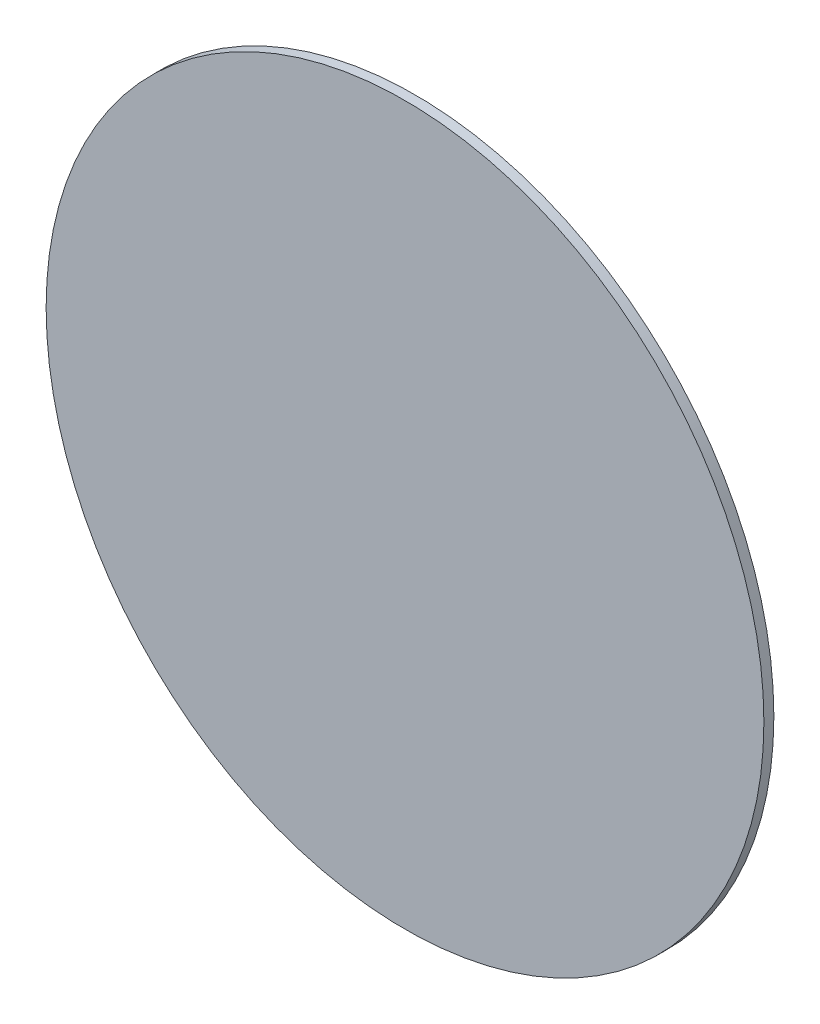
ISO-10303-21;
HEADER;
FILE_DESCRIPTION(('STEP AP214'),'2;1');
FILE_NAME('part.step','',(''),(''),'','','');
FILE_SCHEMA(('AUTOMOTIVE_DESIGN { 1 0 10303 214 1 1 1 1 }'));
ENDSEC;
DATA;
#1=APPLICATION_CONTEXT('core data for automotive mechanical design processes');
#2=APPLICATION_PROTOCOL_DEFINITION('international standard','automotive_design',2000,#1);
#3=PRODUCT_CONTEXT('',#1,'mechanical');
#4=PRODUCT('Part','Part','',(#3));
#5=PRODUCT_RELATED_PRODUCT_CATEGORY('part','',(#4));
#6=PRODUCT_DEFINITION_FORMATION('','',#4);
#7=PRODUCT_DEFINITION_CONTEXT('part definition',#1,'design');
#8=PRODUCT_DEFINITION('design','',#6,#7);
#9=PRODUCT_DEFINITION_SHAPE('','',#8);
#10=(LENGTH_UNIT() NAMED_UNIT(*) SI_UNIT(.MILLI.,.METRE.));
#11=(NAMED_UNIT(*) PLANE_ANGLE_UNIT() SI_UNIT($,.RADIAN.));
#12=(NAMED_UNIT(*) SI_UNIT($,.STERADIAN.) SOLID_ANGLE_UNIT());
#13=UNCERTAINTY_MEASURE_WITH_UNIT(LENGTH_MEASURE(1.E-05),#10,'distance_accuracy_value','');
#14=(GEOMETRIC_REPRESENTATION_CONTEXT(3) GLOBAL_UNCERTAINTY_ASSIGNED_CONTEXT((#13)) GLOBAL_UNIT_ASSIGNED_CONTEXT((#10,
#11,#12)) REPRESENTATION_CONTEXT('',''));
#15=CARTESIAN_POINT('',(0.,0.,0.));
#16=DIRECTION('',(0.,0.,1.));
#17=DIRECTION('',(1.,0.,0.));
#18=AXIS2_PLACEMENT_3D('',#15,#16,#17);
#19=CARTESIAN_POINT('',(0.,0.,10.));
#20=DIRECTION('',(0.,0.,-1.));
#21=DIRECTION('',(-1.,0.,0.));
#22=AXIS2_PLACEMENT_3D('',#19,#20,#21);
#23=CYLINDRICAL_SURFACE('',#22,360.);
#24=CARTESIAN_POINT('',(0.,0.,10.));
#25=DIRECTION('',(0.,0.,1.));
#26=DIRECTION('',(1.,0.,0.));
#27=AXIS2_PLACEMENT_3D('',#24,#25,#26);
#28=CIRCLE('',#27,360.);
#29=CARTESIAN_POINT('',(360.,0.,10.));
#30=VERTEX_POINT('',#29);
#31=EDGE_CURVE('E10',#30,#30,#28,.T.);
#32=ORIENTED_EDGE('',*,*,#31,.F.);
#33=EDGE_LOOP('',(#32));
#34=FACE_BOUND('',#33,.T.);
#35=CARTESIAN_POINT('',(0.,0.,0.));
#36=DIRECTION('',(0.,0.,1.));
#37=DIRECTION('',(1.,0.,0.));
#38=AXIS2_PLACEMENT_3D('',#35,#36,#37);
#39=CIRCLE('',#38,360.);
#40=CARTESIAN_POINT('',(360.,0.,0.));
#41=VERTEX_POINT('',#40);
#42=EDGE_CURVE('E34',#41,#41,#39,.T.);
#43=ORIENTED_EDGE('',*,*,#42,.T.);
#44=EDGE_LOOP('',(#43));
#45=FACE_BOUND('',#44,.T.);
#46=ADVANCED_FACE('F31',(#34,#45),#23,.T.);
#47=CARTESIAN_POINT('',(0.,0.,10.));
#48=DIRECTION('',(0.,0.,1.));
#49=DIRECTION('',(1.,0.,0.));
#50=AXIS2_PLACEMENT_3D('',#47,#48,#49);
#51=PLANE('',#50);
#52=ORIENTED_EDGE('',*,*,#31,.T.);
#53=EDGE_LOOP('',(#52));
#54=FACE_BOUND('',#53,.T.);
#55=ADVANCED_FACE('F46',(#54),#51,.T.);
#56=CARTESIAN_POINT('',(0.,0.,0.));
#57=DIRECTION('',(0.,0.,1.));
#58=DIRECTION('',(1.,0.,0.));
#59=AXIS2_PLACEMENT_3D('',#56,#57,#58);
#60=PLANE('',#59);
#61=ORIENTED_EDGE('',*,*,#42,.F.);
#62=EDGE_LOOP('',(#61));
#63=FACE_BOUND('',#62,.T.);
#64=ADVANCED_FACE('F44',(#63),#60,.F.);
#65=CLOSED_SHELL('',(#46,#55,#64));
#66=MANIFOLD_SOLID_BREP('B2',#65);
#67=ADVANCED_BREP_SHAPE_REPRESENTATION('',(#18,#66),#14);
#68=SHAPE_DEFINITION_REPRESENTATION(#9,#67);
ENDSEC;
END-ISO-10303-21;
